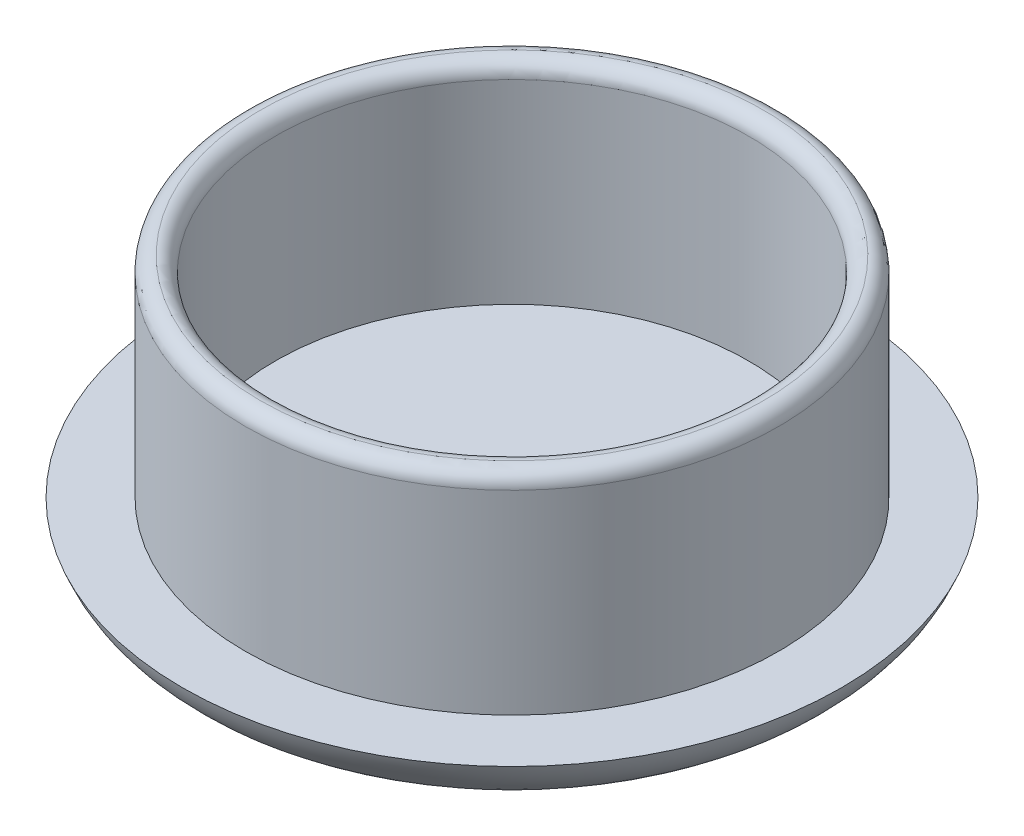
ISO-10303-21;
HEADER;
FILE_DESCRIPTION(('STEP AP214'),'2;1');
FILE_NAME('part.step','',(''),(''),'','','');
FILE_SCHEMA(('AUTOMOTIVE_DESIGN { 1 0 10303 214 1 1 1 1 }'));
ENDSEC;
DATA;
#1=APPLICATION_CONTEXT('core data for automotive mechanical design processes');
#2=APPLICATION_PROTOCOL_DEFINITION('international standard','automotive_design',2000,#1);
#3=PRODUCT_CONTEXT('',#1,'mechanical');
#4=PRODUCT('Part','Part','',(#3));
#5=PRODUCT_RELATED_PRODUCT_CATEGORY('part','',(#4));
#6=PRODUCT_DEFINITION_FORMATION('','',#4);
#7=PRODUCT_DEFINITION_CONTEXT('part definition',#1,'design');
#8=PRODUCT_DEFINITION('design','',#6,#7);
#9=PRODUCT_DEFINITION_SHAPE('','',#8);
#10=(LENGTH_UNIT() NAMED_UNIT(*) SI_UNIT(.MILLI.,.METRE.));
#11=(NAMED_UNIT(*) PLANE_ANGLE_UNIT() SI_UNIT($,.RADIAN.));
#12=(NAMED_UNIT(*) SI_UNIT($,.STERADIAN.) SOLID_ANGLE_UNIT());
#13=UNCERTAINTY_MEASURE_WITH_UNIT(LENGTH_MEASURE(1.E-05),#10,'distance_accuracy_value','');
#14=(GEOMETRIC_REPRESENTATION_CONTEXT(3) GLOBAL_UNCERTAINTY_ASSIGNED_CONTEXT((#13)) GLOBAL_UNIT_ASSIGNED_CONTEXT((#10,
#11,#12)) REPRESENTATION_CONTEXT('',''));
#15=CARTESIAN_POINT('',(0.,0.,0.));
#16=DIRECTION('',(0.,0.,1.));
#17=DIRECTION('',(1.,0.,0.));
#18=AXIS2_PLACEMENT_3D('',#15,#16,#17);
#19=CARTESIAN_POINT('',(0.,2.,0.));
#20=DIRECTION('',(0.,1.,0.));
#21=DIRECTION('',(0.,0.,1.));
#22=AXIS2_PLACEMENT_3D('',#19,#20,#21);
#23=PLANE('',#22);
#24=CARTESIAN_POINT('',(0.,2.,0.));
#25=DIRECTION('',(0.,1.,0.));
#26=DIRECTION('',(0.,0.,1.));
#27=AXIS2_PLACEMENT_3D('',#24,#25,#26);
#28=CIRCLE('',#27,8.9);
#29=CARTESIAN_POINT('',(0.,2.,8.9));
#30=VERTEX_POINT('',#29);
#31=EDGE_CURVE('E59',#30,#30,#28,.T.);
#32=ORIENTED_EDGE('',*,*,#31,.F.);
#33=EDGE_LOOP('',(#32));
#34=FACE_BOUND('',#33,.T.);
#35=CARTESIAN_POINT('',(0.,2.,0.));
#36=DIRECTION('',(0.,1.,0.));
#37=DIRECTION('',(0.,0.,1.));
#38=AXIS2_PLACEMENT_3D('',#35,#36,#37);
#39=CIRCLE('',#38,11.);
#40=CARTESIAN_POINT('',(0.,2.,11.));
#41=VERTEX_POINT('',#40);
#42=EDGE_CURVE('E56',#41,#41,#39,.T.);
#43=ORIENTED_EDGE('',*,*,#42,.T.);
#44=EDGE_LOOP('',(#43));
#45=FACE_BOUND('',#44,.T.);
#46=ADVANCED_FACE('F36',(#34,#45),#23,.T.);
#47=CARTESIAN_POINT('',(0.,0.,0.));
#48=DIRECTION('',(0.,1.,0.));
#49=DIRECTION('',(0.,0.,1.));
#50=AXIS2_PLACEMENT_3D('',#47,#48,#49);
#51=PLANE('',#50);
#52=CARTESIAN_POINT('',(0.,0.,0.));
#53=DIRECTION('',(0.,1.,0.));
#54=DIRECTION('',(0.,0.,1.));
#55=AXIS2_PLACEMENT_3D('',#52,#53,#54);
#56=CIRCLE('',#55,8.17157287525381);
#57=CARTESIAN_POINT('',(0.,0.,8.17157287525381));
#58=VERTEX_POINT('',#57);
#59=EDGE_CURVE('E48',#58,#58,#56,.F.);
#60=ORIENTED_EDGE('',*,*,#59,.T.);
#61=EDGE_LOOP('',(#60));
#62=FACE_BOUND('',#61,.T.);
#63=CARTESIAN_POINT('',(0.,0.,0.));
#64=DIRECTION('',(0.,1.,0.));
#65=DIRECTION('',(0.,0.,1.));
#66=AXIS2_PLACEMENT_3D('',#63,#64,#65);
#67=CIRCLE('',#66,1.65);
#68=CARTESIAN_POINT('',(0.,0.,1.65));
#69=VERTEX_POINT('',#68);
#70=EDGE_CURVE('E62',#69,#69,#67,.T.);
#71=ORIENTED_EDGE('',*,*,#70,.T.);
#72=EDGE_LOOP('',(#71));
#73=FACE_BOUND('',#72,.T.);
#74=ADVANCED_FACE('F69',(#62,#73),#51,.F.);
#75=CARTESIAN_POINT('',(0.,9.,0.));
#76=DIRECTION('',(0.,-1.,0.));
#77=DIRECTION('',(0.,0.,-1.));
#78=AXIS2_PLACEMENT_3D('',#75,#76,#77);
#79=CYLINDRICAL_SURFACE('',#78,8.9);
#80=CARTESIAN_POINT('',(0.,8.5,0.));
#81=DIRECTION('',(0.,1.,0.));
#82=DIRECTION('',(0.,0.,1.));
#83=AXIS2_PLACEMENT_3D('',#80,#81,#82);
#84=CIRCLE('',#83,8.9);
#85=CARTESIAN_POINT('',(0.,8.5,8.9));
#86=VERTEX_POINT('',#85);
#87=EDGE_CURVE('E10',#86,#86,#84,.F.);
#88=ORIENTED_EDGE('',*,*,#87,.T.);
#89=EDGE_LOOP('',(#88));
#90=FACE_BOUND('',#89,.T.);
#91=ORIENTED_EDGE('',*,*,#31,.T.);
#92=EDGE_LOOP('',(#91));
#93=FACE_BOUND('',#92,.T.);
#94=ADVANCED_FACE('F86',(#90,#93),#79,.T.);
#95=CARTESIAN_POINT('',(0.,9.,0.));
#96=DIRECTION('',(0.,-1.,0.));
#97=DIRECTION('',(0.,0.,-1.));
#98=AXIS2_PLACEMENT_3D('',#95,#96,#97);
#99=CYLINDRICAL_SURFACE('',#98,7.9);
#100=CARTESIAN_POINT('',(0.,8.5,0.));
#101=DIRECTION('',(0.,1.,0.));
#102=DIRECTION('',(0.,0.,1.));
#103=AXIS2_PLACEMENT_3D('',#100,#101,#102);
#104=CIRCLE('',#103,7.9);
#105=CARTESIAN_POINT('',(0.,8.5,7.9));
#106=VERTEX_POINT('',#105);
#107=EDGE_CURVE('E44',#106,#106,#104,.T.);
#108=ORIENTED_EDGE('',*,*,#107,.T.);
#109=EDGE_LOOP('',(#108));
#110=FACE_BOUND('',#109,.T.);
#111=CARTESIAN_POINT('',(0.,2.,0.));
#112=DIRECTION('',(0.,1.,0.));
#113=DIRECTION('',(0.,0.,1.));
#114=AXIS2_PLACEMENT_3D('',#111,#112,#113);
#115=CIRCLE('',#114,7.9);
#116=CARTESIAN_POINT('',(0.,2.,7.9));
#117=VERTEX_POINT('',#116);
#118=EDGE_CURVE('E53',#117,#117,#115,.F.);
#119=ORIENTED_EDGE('',*,*,#118,.T.);
#120=EDGE_LOOP('',(#119));
#121=FACE_BOUND('',#120,.T.);
#122=ADVANCED_FACE('F81',(#110,#121),#99,.F.);
#123=CARTESIAN_POINT('',(0.,2.,0.));
#124=DIRECTION('',(0.,1.,0.));
#125=DIRECTION('',(0.,0.,1.));
#126=AXIS2_PLACEMENT_3D('',#123,#124,#125);
#127=CIRCLE('',#126,1.65);
#128=CARTESIAN_POINT('',(0.,2.,1.65));
#129=VERTEX_POINT('',#128);
#130=EDGE_CURVE('E63',#129,#129,#127,.T.);
#131=ORIENTED_EDGE('',*,*,#130,.F.);
#132=EDGE_LOOP('',(#131));
#133=FACE_BOUND('',#132,.T.);
#134=ORIENTED_EDGE('',*,*,#118,.F.);
#135=EDGE_LOOP('',(#134));
#136=FACE_BOUND('',#135,.T.);
#137=ADVANCED_FACE('F75',(#133,#136),#23,.T.);
#138=CARTESIAN_POINT('',(0.,0.,0.));
#139=DIRECTION('',(0.,1.,0.));
#140=DIRECTION('',(0.,0.,1.));
#141=AXIS2_PLACEMENT_3D('',#138,#139,#140);
#142=CYLINDRICAL_SURFACE('',#141,1.65);
#143=ORIENTED_EDGE('',*,*,#70,.F.);
#144=EDGE_LOOP('',(#143));
#145=FACE_BOUND('',#144,.T.);
#146=ORIENTED_EDGE('',*,*,#130,.T.);
#147=EDGE_LOOP('',(#146));
#148=FACE_BOUND('',#147,.T.);
#149=ADVANCED_FACE('F71',(#145,#148),#142,.F.);
#150=CARTESIAN_POINT('',(0.,3.,0.));
#151=DIRECTION('',(0.,-1.,0.));
#152=DIRECTION('',(0.,0.,-1.));
#153=AXIS2_PLACEMENT_3D('',#150,#151,#152);
#154=TOROIDAL_SURFACE('',#153,8.17157287525381,3.);
#155=ORIENTED_EDGE('',*,*,#59,.F.);
#156=EDGE_LOOP('',(#155));
#157=FACE_BOUND('',#156,.T.);
#158=ORIENTED_EDGE('',*,*,#42,.F.);
#159=EDGE_LOOP('',(#158));
#160=FACE_BOUND('',#159,.T.);
#161=ADVANCED_FACE('F74',(#157,#160),#154,.T.);
#162=CARTESIAN_POINT('',(0.,8.5,0.));
#163=DIRECTION('',(0.,1.,0.));
#164=DIRECTION('',(0.,0.,1.));
#165=AXIS2_PLACEMENT_3D('',#162,#163,#164);
#166=TOROIDAL_SURFACE('',#165,8.4,0.5);
#167=ORIENTED_EDGE('',*,*,#87,.F.);
#168=EDGE_LOOP('',(#167));
#169=FACE_BOUND('',#168,.T.);
#170=CARTESIAN_POINT('',(0.,9.,0.));
#171=DIRECTION('',(0.,1.,0.));
#172=DIRECTION('',(0.,0.,1.));
#173=AXIS2_PLACEMENT_3D('',#170,#171,#172);
#174=CIRCLE('',#173,8.4);
#175=CARTESIAN_POINT('',(0.,9.,8.4));
#176=VERTEX_POINT('',#175);
#177=EDGE_CURVE('E40',#176,#176,#174,.T.);
#178=ORIENTED_EDGE('',*,*,#177,.F.);
#179=EDGE_LOOP('',(#178));
#180=FACE_BOUND('',#179,.T.);
#181=ADVANCED_FACE('F38',(#169,#180),#166,.T.);
#182=CARTESIAN_POINT('',(0.,8.5,0.));
#183=DIRECTION('',(0.,1.,0.));
#184=DIRECTION('',(0.,0.,1.));
#185=AXIS2_PLACEMENT_3D('',#182,#183,#184);
#186=TOROIDAL_SURFACE('',#185,8.4,0.5);
#187=ORIENTED_EDGE('',*,*,#177,.T.);
#188=EDGE_LOOP('',(#187));
#189=FACE_BOUND('',#188,.T.);
#190=ORIENTED_EDGE('',*,*,#107,.F.);
#191=EDGE_LOOP('',(#190));
#192=FACE_BOUND('',#191,.T.);
#193=ADVANCED_FACE('F105',(#189,#192),#186,.T.);
#194=CLOSED_SHELL('',(#46,#74,#94,#122,#137,#149,#161,#181,#193));
#195=MANIFOLD_SOLID_BREP('B2',#194);
#196=ADVANCED_BREP_SHAPE_REPRESENTATION('',(#18,#195),#14);
#197=SHAPE_DEFINITION_REPRESENTATION(#9,#196);
ENDSEC;
END-ISO-10303-21;
